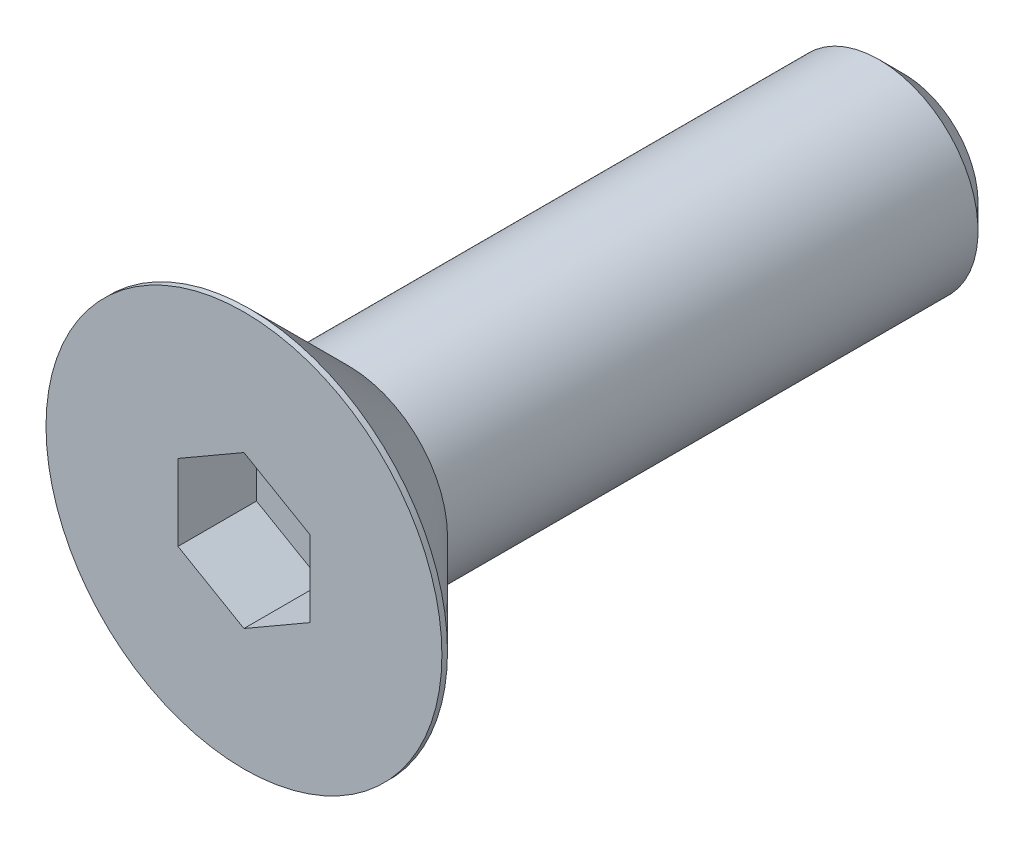
ISO-10303-21;
HEADER;
FILE_DESCRIPTION(('STEP AP214'),'2;1');
FILE_NAME('part.step','',(''),(''),'','','');
FILE_SCHEMA(('AUTOMOTIVE_DESIGN { 1 0 10303 214 1 1 1 1 }'));
ENDSEC;
DATA;
#1=APPLICATION_CONTEXT('core data for automotive mechanical design processes');
#2=APPLICATION_PROTOCOL_DEFINITION('international standard','automotive_design',2000,#1);
#3=PRODUCT_CONTEXT('',#1,'mechanical');
#4=PRODUCT('Part','Part','',(#3));
#5=PRODUCT_RELATED_PRODUCT_CATEGORY('part','',(#4));
#6=PRODUCT_DEFINITION_FORMATION('','',#4);
#7=PRODUCT_DEFINITION_CONTEXT('part definition',#1,'design');
#8=PRODUCT_DEFINITION('design','',#6,#7);
#9=PRODUCT_DEFINITION_SHAPE('','',#8);
#10=(LENGTH_UNIT() NAMED_UNIT(*) SI_UNIT(.MILLI.,.METRE.));
#11=(NAMED_UNIT(*) PLANE_ANGLE_UNIT() SI_UNIT($,.RADIAN.));
#12=(NAMED_UNIT(*) SI_UNIT($,.STERADIAN.) SOLID_ANGLE_UNIT());
#13=UNCERTAINTY_MEASURE_WITH_UNIT(LENGTH_MEASURE(1.E-05),#10,'distance_accuracy_value','');
#14=(GEOMETRIC_REPRESENTATION_CONTEXT(3) GLOBAL_UNCERTAINTY_ASSIGNED_CONTEXT((#13)) GLOBAL_UNIT_ASSIGNED_CONTEXT((#10,
#11,#12)) REPRESENTATION_CONTEXT('',''));
#15=CARTESIAN_POINT('',(0.,0.,0.));
#16=DIRECTION('',(0.,0.,1.));
#17=DIRECTION('',(1.,0.,0.));
#18=AXIS2_PLACEMENT_3D('',#15,#16,#17);
#19=CARTESIAN_POINT('',(0.,0.,4.915));
#20=DIRECTION('',(0.,0.,1.));
#21=DIRECTION('',(0.,-1.,0.));
#22=AXIS2_PLACEMENT_3D('',#19,#20,#21);
#23=CONICAL_SURFACE('',#22,3.,0.785398163397448);
#24=CARTESIAN_POINT('',(0.,0.,3.3));
#25=DIRECTION('',(0.,0.,1.));
#26=DIRECTION('',(0.,-1.,0.));
#27=AXIS2_PLACEMENT_3D('',#24,#25,#26);
#28=CIRCLE('',#27,1.385);
#29=CARTESIAN_POINT('',(0.,-1.385,3.3));
#30=VERTEX_POINT('',#29);
#31=EDGE_CURVE('E150',#30,#30,#28,.T.);
#32=ORIENTED_EDGE('',*,*,#31,.T.);
#33=EDGE_LOOP('',(#32));
#34=FACE_BOUND('',#33,.T.);
#35=CARTESIAN_POINT('',(0.,0.,4.915));
#36=DIRECTION('',(0.,0.,1.));
#37=DIRECTION('',(0.,-1.,0.));
#38=AXIS2_PLACEMENT_3D('',#35,#36,#37);
#39=CIRCLE('',#38,3.);
#40=CARTESIAN_POINT('',(0.,-3.,4.915));
#41=VERTEX_POINT('',#40);
#42=EDGE_CURVE('E12',#41,#41,#39,.T.);
#43=ORIENTED_EDGE('',*,*,#42,.F.);
#44=EDGE_LOOP('',(#43));
#45=FACE_BOUND('',#44,.T.);
#46=ADVANCED_FACE('F49',(#34,#45),#23,.T.);
#47=CARTESIAN_POINT('',(0.,0.,5.));
#48=DIRECTION('',(0.,0.,1.));
#49=DIRECTION('',(0.,-1.,0.));
#50=AXIS2_PLACEMENT_3D('',#47,#48,#49);
#51=CYLINDRICAL_SURFACE('',#50,3.);
#52=ORIENTED_EDGE('',*,*,#42,.T.);
#53=EDGE_LOOP('',(#52));
#54=FACE_BOUND('',#53,.T.);
#55=CARTESIAN_POINT('',(0.,0.,5.));
#56=DIRECTION('',(0.,0.,1.));
#57=DIRECTION('',(0.,-1.,0.));
#58=AXIS2_PLACEMENT_3D('',#55,#56,#57);
#59=CIRCLE('',#58,3.);
#60=CARTESIAN_POINT('',(0.,-3.,5.));
#61=VERTEX_POINT('',#60);
#62=EDGE_CURVE('E56',#61,#61,#59,.T.);
#63=ORIENTED_EDGE('',*,*,#62,.F.);
#64=EDGE_LOOP('',(#63));
#65=FACE_BOUND('',#64,.T.);
#66=ADVANCED_FACE('F162',(#54,#65),#51,.T.);
#67=CARTESIAN_POINT('',(0.,0.,5.));
#68=DIRECTION('',(0.,0.,-1.));
#69=DIRECTION('',(0.,1.,0.));
#70=AXIS2_PLACEMENT_3D('',#67,#68,#69);
#71=PLANE('',#70);
#72=DIRECTION('',(0.,1.,0.));
#73=VECTOR('',#72,1.);
#74=CARTESIAN_POINT('',(1.,-0.577350269189628,5.));
#75=LINE('',#74,#73);
#76=CARTESIAN_POINT('',(1.,-0.577350269189628,5.));
#77=VERTEX_POINT('',#76);
#78=CARTESIAN_POINT('',(1.,0.577350269189625,5.));
#79=VERTEX_POINT('',#78);
#80=EDGE_CURVE('E137',#77,#79,#75,.T.);
#81=ORIENTED_EDGE('',*,*,#80,.F.);
#82=DIRECTION('',(0.866025403784438,0.5,0.));
#83=VECTOR('',#82,1.);
#84=CARTESIAN_POINT('',(0.,-1.15470053837926,5.));
#85=LINE('',#84,#83);
#86=CARTESIAN_POINT('',(0.,-1.15470053837926,5.));
#87=VERTEX_POINT('',#86);
#88=EDGE_CURVE('E63',#87,#77,#85,.T.);
#89=ORIENTED_EDGE('',*,*,#88,.F.);
#90=DIRECTION('',(0.866025403784439,-0.5,0.));
#91=VECTOR('',#90,1.);
#92=CARTESIAN_POINT('',(-1.,-0.577350269189629,5.));
#93=LINE('',#92,#91);
#94=CARTESIAN_POINT('',(-1.,-0.577350269189629,5.));
#95=VERTEX_POINT('',#94);
#96=EDGE_CURVE('E146',#95,#87,#93,.T.);
#97=ORIENTED_EDGE('',*,*,#96,.F.);
#98=DIRECTION('',(0.,-1.,0.));
#99=VECTOR('',#98,1.);
#100=CARTESIAN_POINT('',(-1.,0.577350269189625,5.));
#101=LINE('',#100,#99);
#102=CARTESIAN_POINT('',(-1.,0.577350269189625,5.));
#103=VERTEX_POINT('',#102);
#104=EDGE_CURVE('E144',#103,#95,#101,.T.);
#105=ORIENTED_EDGE('',*,*,#104,.F.);
#106=DIRECTION('',(-0.866025403784439,-0.5,0.));
#107=VECTOR('',#106,1.);
#108=CARTESIAN_POINT('',(0.,1.15470053837925,5.));
#109=LINE('',#108,#107);
#110=CARTESIAN_POINT('',(0.,1.15470053837925,5.));
#111=VERTEX_POINT('',#110);
#112=EDGE_CURVE('E111',#111,#103,#109,.T.);
#113=ORIENTED_EDGE('',*,*,#112,.F.);
#114=DIRECTION('',(-0.866025403784439,0.5,0.));
#115=VECTOR('',#114,1.);
#116=CARTESIAN_POINT('',(1.,0.577350269189625,5.));
#117=LINE('',#116,#115);
#118=EDGE_CURVE('E140',#79,#111,#117,.T.);
#119=ORIENTED_EDGE('',*,*,#118,.F.);
#120=EDGE_LOOP('',(#81,#89,#97,#105,#113,#119));
#121=FACE_BOUND('',#120,.T.);
#122=ORIENTED_EDGE('',*,*,#62,.T.);
#123=EDGE_LOOP('',(#122));
#124=FACE_BOUND('',#123,.T.);
#125=ADVANCED_FACE('F160',(#121,#124),#71,.F.);
#126=CARTESIAN_POINT('',(0.,0.,3.3));
#127=DIRECTION('',(0.,0.,-1.));
#128=DIRECTION('',(0.,1.,0.));
#129=AXIS2_PLACEMENT_3D('',#126,#127,#128);
#130=PLANE('',#129);
#131=ORIENTED_EDGE('',*,*,#31,.F.);
#132=EDGE_LOOP('',(#131));
#133=FACE_BOUND('',#132,.T.);
#134=ADVANCED_FACE('F169',(#133),#130,.T.);
#135=CARTESIAN_POINT('',(0.,-1.15470053837926,3.81));
#136=DIRECTION('',(0.5,-0.866025403784439,0.));
#137=DIRECTION('',(0.866025403784439,0.5,0.));
#138=AXIS2_PLACEMENT_3D('',#135,#136,#137);
#139=PLANE('',#138);
#140=ORIENTED_EDGE('',*,*,#88,.T.);
#141=DIRECTION('',(0.,0.,1.));
#142=VECTOR('',#141,1.);
#143=CARTESIAN_POINT('',(1.,-0.577350269189628,3.81));
#144=LINE('',#143,#142);
#145=CARTESIAN_POINT('',(1.,-0.577350269189628,3.81));
#146=VERTEX_POINT('',#145);
#147=EDGE_CURVE('E93',#146,#77,#144,.T.);
#148=ORIENTED_EDGE('',*,*,#147,.F.);
#149=DIRECTION('',(0.866025403784438,0.5,0.));
#150=VECTOR('',#149,1.);
#151=CARTESIAN_POINT('',(0.,-1.15470053837926,3.81));
#152=LINE('',#151,#150);
#153=CARTESIAN_POINT('',(0.,-1.15470053837926,3.81));
#154=VERTEX_POINT('',#153);
#155=EDGE_CURVE('E148',#154,#146,#152,.T.);
#156=ORIENTED_EDGE('',*,*,#155,.F.);
#157=DIRECTION('',(0.,0.,1.));
#158=VECTOR('',#157,1.);
#159=CARTESIAN_POINT('',(0.,-1.15470053837926,3.81));
#160=LINE('',#159,#158);
#161=EDGE_CURVE('E71',#154,#87,#160,.T.);
#162=ORIENTED_EDGE('',*,*,#161,.T.);
#163=EDGE_LOOP('',(#140,#148,#156,#162));
#164=FACE_BOUND('',#163,.T.);
#165=ADVANCED_FACE('F176',(#164),#139,.F.);
#166=CARTESIAN_POINT('',(-1.,-0.577350269189629,3.81));
#167=DIRECTION('',(-0.5,-0.866025403784439,0.));
#168=DIRECTION('',(0.866025403784439,-0.5,0.));
#169=AXIS2_PLACEMENT_3D('',#166,#167,#168);
#170=PLANE('',#169);
#171=ORIENTED_EDGE('',*,*,#96,.T.);
#172=ORIENTED_EDGE('',*,*,#161,.F.);
#173=DIRECTION('',(0.866025403784439,-0.5,0.));
#174=VECTOR('',#173,1.);
#175=CARTESIAN_POINT('',(-1.,-0.577350269189629,3.81));
#176=LINE('',#175,#174);
#177=CARTESIAN_POINT('',(-1.,-0.577350269189629,3.81));
#178=VERTEX_POINT('',#177);
#179=EDGE_CURVE('E123',#178,#154,#176,.T.);
#180=ORIENTED_EDGE('',*,*,#179,.F.);
#181=DIRECTION('',(0.,0.,1.));
#182=VECTOR('',#181,1.);
#183=CARTESIAN_POINT('',(-1.,-0.577350269189629,3.81));
#184=LINE('',#183,#182);
#185=EDGE_CURVE('E115',#178,#95,#184,.T.);
#186=ORIENTED_EDGE('',*,*,#185,.T.);
#187=EDGE_LOOP('',(#171,#172,#180,#186));
#188=FACE_BOUND('',#187,.T.);
#189=ADVANCED_FACE('F180',(#188),#170,.F.);
#190=CARTESIAN_POINT('',(-1.,0.577350269189625,3.81));
#191=DIRECTION('',(-1.,0.,0.));
#192=DIRECTION('',(0.,-1.,0.));
#193=AXIS2_PLACEMENT_3D('',#190,#191,#192);
#194=PLANE('',#193);
#195=ORIENTED_EDGE('',*,*,#104,.T.);
#196=ORIENTED_EDGE('',*,*,#185,.F.);
#197=DIRECTION('',(0.,-1.,0.));
#198=VECTOR('',#197,1.);
#199=CARTESIAN_POINT('',(-1.,0.577350269189625,3.81));
#200=LINE('',#199,#198);
#201=CARTESIAN_POINT('',(-1.,0.577350269189625,3.81));
#202=VERTEX_POINT('',#201);
#203=EDGE_CURVE('E119',#202,#178,#200,.T.);
#204=ORIENTED_EDGE('',*,*,#203,.F.);
#205=DIRECTION('',(0.,0.,1.));
#206=VECTOR('',#205,1.);
#207=CARTESIAN_POINT('',(-1.,0.577350269189625,3.81));
#208=LINE('',#207,#206);
#209=EDGE_CURVE('E104',#202,#103,#208,.T.);
#210=ORIENTED_EDGE('',*,*,#209,.T.);
#211=EDGE_LOOP('',(#195,#196,#204,#210));
#212=FACE_BOUND('',#211,.T.);
#213=ADVANCED_FACE('F120',(#212),#194,.F.);
#214=CARTESIAN_POINT('',(0.,1.15470053837925,3.81));
#215=DIRECTION('',(-0.5,0.866025403784439,0.));
#216=DIRECTION('',(-0.866025403784439,-0.5,0.));
#217=AXIS2_PLACEMENT_3D('',#214,#215,#216);
#218=PLANE('',#217);
#219=ORIENTED_EDGE('',*,*,#112,.T.);
#220=ORIENTED_EDGE('',*,*,#209,.F.);
#221=DIRECTION('',(-0.866025403784439,-0.5,0.));
#222=VECTOR('',#221,1.);
#223=CARTESIAN_POINT('',(0.,1.15470053837925,3.81));
#224=LINE('',#223,#222);
#225=CARTESIAN_POINT('',(0.,1.15470053837925,3.81));
#226=VERTEX_POINT('',#225);
#227=EDGE_CURVE('E108',#226,#202,#224,.T.);
#228=ORIENTED_EDGE('',*,*,#227,.F.);
#229=DIRECTION('',(0.,0.,1.));
#230=VECTOR('',#229,1.);
#231=CARTESIAN_POINT('',(0.,1.15470053837925,3.81));
#232=LINE('',#231,#230);
#233=EDGE_CURVE('E116',#226,#111,#232,.T.);
#234=ORIENTED_EDGE('',*,*,#233,.T.);
#235=EDGE_LOOP('',(#219,#220,#228,#234));
#236=FACE_BOUND('',#235,.T.);
#237=ADVANCED_FACE('F106',(#236),#218,.F.);
#238=CARTESIAN_POINT('',(1.,0.577350269189625,3.81));
#239=DIRECTION('',(0.5,0.866025403784439,0.));
#240=DIRECTION('',(-0.866025403784439,0.5,0.));
#241=AXIS2_PLACEMENT_3D('',#238,#239,#240);
#242=PLANE('',#241);
#243=ORIENTED_EDGE('',*,*,#118,.T.);
#244=ORIENTED_EDGE('',*,*,#233,.F.);
#245=DIRECTION('',(-0.866025403784439,0.5,0.));
#246=VECTOR('',#245,1.);
#247=CARTESIAN_POINT('',(1.,0.577350269189625,3.81));
#248=LINE('',#247,#246);
#249=CARTESIAN_POINT('',(1.,0.577350269189625,3.81));
#250=VERTEX_POINT('',#249);
#251=EDGE_CURVE('E129',#250,#226,#248,.T.);
#252=ORIENTED_EDGE('',*,*,#251,.F.);
#253=DIRECTION('',(0.,0.,1.));
#254=VECTOR('',#253,1.);
#255=CARTESIAN_POINT('',(1.,0.577350269189625,3.81));
#256=LINE('',#255,#254);
#257=EDGE_CURVE('E153',#250,#79,#256,.T.);
#258=ORIENTED_EDGE('',*,*,#257,.T.);
#259=EDGE_LOOP('',(#243,#244,#252,#258));
#260=FACE_BOUND('',#259,.T.);
#261=ADVANCED_FACE('F184',(#260),#242,.F.);
#262=CARTESIAN_POINT('',(1.,-0.577350269189628,3.81));
#263=DIRECTION('',(1.,0.,0.));
#264=DIRECTION('',(0.,1.,0.));
#265=AXIS2_PLACEMENT_3D('',#262,#263,#264);
#266=PLANE('',#265);
#267=ORIENTED_EDGE('',*,*,#80,.T.);
#268=ORIENTED_EDGE('',*,*,#257,.F.);
#269=DIRECTION('',(0.,1.,0.));
#270=VECTOR('',#269,1.);
#271=CARTESIAN_POINT('',(1.,-0.577350269189628,3.81));
#272=LINE('',#271,#270);
#273=EDGE_CURVE('E131',#146,#250,#272,.T.);
#274=ORIENTED_EDGE('',*,*,#273,.F.);
#275=ORIENTED_EDGE('',*,*,#147,.T.);
#276=EDGE_LOOP('',(#267,#268,#274,#275));
#277=FACE_BOUND('',#276,.T.);
#278=ADVANCED_FACE('F181',(#277),#266,.F.);
#279=CARTESIAN_POINT('',(1.,-0.577350269189628,3.81));
#280=DIRECTION('',(0.,0.,1.));
#281=DIRECTION('',(1.,0.,0.));
#282=AXIS2_PLACEMENT_3D('',#279,#280,#281);
#283=PLANE('',#282);
#284=ORIENTED_EDGE('',*,*,#155,.T.);
#285=ORIENTED_EDGE('',*,*,#273,.T.);
#286=ORIENTED_EDGE('',*,*,#251,.T.);
#287=ORIENTED_EDGE('',*,*,#227,.T.);
#288=ORIENTED_EDGE('',*,*,#203,.T.);
#289=ORIENTED_EDGE('',*,*,#179,.T.);
#290=EDGE_LOOP('',(#284,#285,#286,#287,#288,#289));
#291=FACE_BOUND('',#290,.T.);
#292=ADVANCED_FACE('F126',(#291),#283,.T.);
#293=CLOSED_SHELL('',(#46,#66,#125,#134,#165,#189,#213,#237,#261,#278,#292));
#294=MANIFOLD_SOLID_BREP('B2',#293);
#295=CARTESIAN_POINT('',(0.,-1.50000000000001,3.81000000000001));
#296=DIRECTION('',(0.,0.,-1.));
#297=DIRECTION('',(0.,1.,0.));
#298=AXIS2_PLACEMENT_3D('',#295,#296,#297);
#299=PLANE('',#298);
#300=CARTESIAN_POINT('',(0.,0.,3.81000000000001));
#301=DIRECTION('',(0.,0.,1.));
#302=DIRECTION('',(0.,-1.,0.));
#303=AXIS2_PLACEMENT_3D('',#300,#301,#302);
#304=CIRCLE('',#303,1.50000000000001);
#305=CARTESIAN_POINT('',(0.,-1.50000000000001,3.81000000000001));
#306=VERTEX_POINT('',#305);
#307=EDGE_CURVE('E283',#306,#306,#304,.T.);
#308=ORIENTED_EDGE('',*,*,#307,.T.);
#309=EDGE_LOOP('',(#308));
#310=FACE_BOUND('',#309,.T.);
#311=ADVANCED_FACE('F270',(#310),#299,.F.);
#312=CARTESIAN_POINT('',(0.,-1.5,-5.00000000000001));
#313=DIRECTION('',(0.,0.,1.));
#314=DIRECTION('',(0.,-1.,0.));
#315=AXIS2_PLACEMENT_3D('',#312,#313,#314);
#316=PLANE('',#315);
#317=CARTESIAN_POINT('',(0.,0.,-5.00000000000001));
#318=DIRECTION('',(0.,0.,1.));
#319=DIRECTION('',(0.,-1.,0.));
#320=AXIS2_PLACEMENT_3D('',#317,#318,#319);
#321=CIRCLE('',#320,1.125);
#322=CARTESIAN_POINT('',(0.,-1.125,-5.00000000000001));
#323=VERTEX_POINT('',#322);
#324=EDGE_CURVE('E48',#323,#323,#321,.F.);
#325=ORIENTED_EDGE('',*,*,#324,.T.);
#326=EDGE_LOOP('',(#325));
#327=FACE_BOUND('',#326,.T.);
#328=ADVANCED_FACE('F294',(#327),#316,.F.);
#329=CARTESIAN_POINT('',(0.,0.,3.81));
#330=DIRECTION('',(0.,0.,1.));
#331=DIRECTION('',(0.,-1.,0.));
#332=AXIS2_PLACEMENT_3D('',#329,#330,#331);
#333=CYLINDRICAL_SURFACE('',#332,1.50000000000001);
#334=CARTESIAN_POINT('',(0.,0.,-4.62500000000001));
#335=DIRECTION('',(0.,0.,1.));
#336=DIRECTION('',(0.,-1.,0.));
#337=AXIS2_PLACEMENT_3D('',#334,#335,#336);
#338=CIRCLE('',#337,1.50000000000001);
#339=CARTESIAN_POINT('',(0.,-1.50000000000001,-4.62500000000001));
#340=VERTEX_POINT('',#339);
#341=EDGE_CURVE('E278',#340,#340,#338,.T.);
#342=ORIENTED_EDGE('',*,*,#341,.T.);
#343=EDGE_LOOP('',(#342));
#344=FACE_BOUND('',#343,.T.);
#345=ORIENTED_EDGE('',*,*,#307,.F.);
#346=EDGE_LOOP('',(#345));
#347=FACE_BOUND('',#346,.T.);
#348=ADVANCED_FACE('F292',(#344,#347),#333,.T.);
#349=CARTESIAN_POINT('',(0.,0.,-4.62500000000001));
#350=DIRECTION('',(0.,0.,1.));
#351=DIRECTION('',(0.,-1.,0.));
#352=AXIS2_PLACEMENT_3D('',#349,#350,#351);
#353=CONICAL_SURFACE('',#352,1.50000000000001,0.785398163397452);
#354=ORIENTED_EDGE('',*,*,#324,.F.);
#355=EDGE_LOOP('',(#354));
#356=FACE_BOUND('',#355,.T.);
#357=ORIENTED_EDGE('',*,*,#341,.F.);
#358=EDGE_LOOP('',(#357));
#359=FACE_BOUND('',#358,.T.);
#360=ADVANCED_FACE('F272',(#356,#359),#353,.T.);
#361=CLOSED_SHELL('',(#311,#328,#348,#360));
#362=MANIFOLD_SOLID_BREP('B6',#361);
#363=ADVANCED_BREP_SHAPE_REPRESENTATION('',(#18,#294,#362),#14);
#364=SHAPE_DEFINITION_REPRESENTATION(#9,#363);
ENDSEC;
END-ISO-10303-21;
